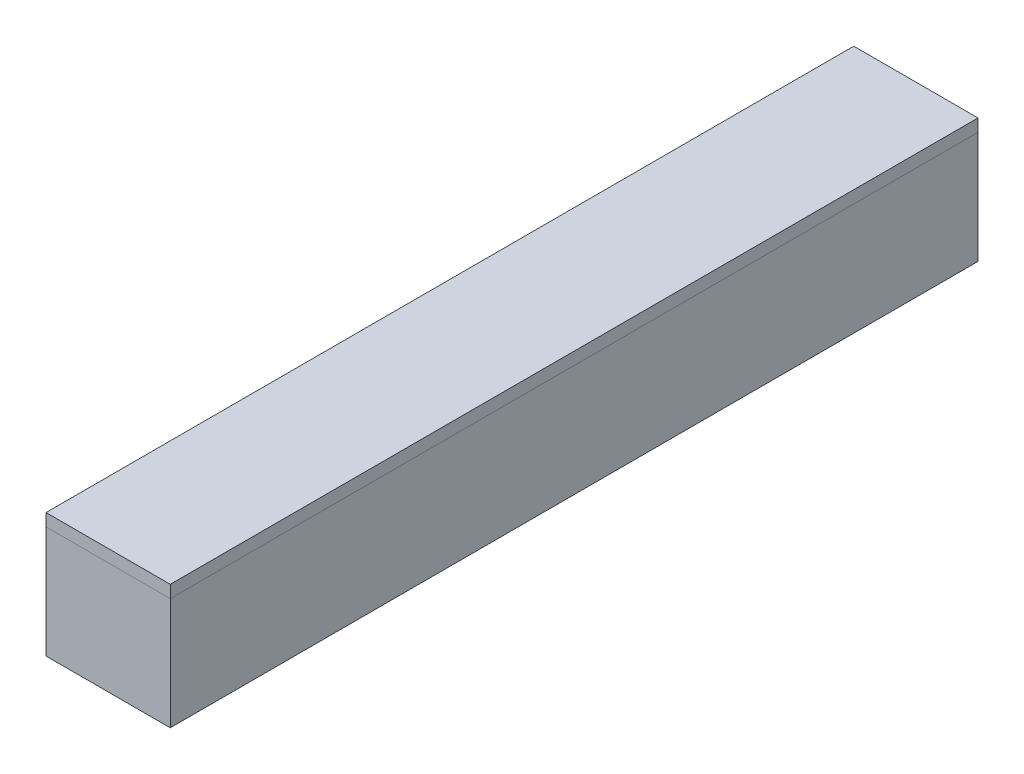
ISO-10303-21;
HEADER;
FILE_DESCRIPTION(('STEP AP214'),'2;1');
FILE_NAME('part.step','',(''),(''),'','','');
FILE_SCHEMA(('AUTOMOTIVE_DESIGN { 1 0 10303 214 1 1 1 1 }'));
ENDSEC;
DATA;
#1=APPLICATION_CONTEXT('core data for automotive mechanical design processes');
#2=APPLICATION_PROTOCOL_DEFINITION('international standard','automotive_design',2000,#1);
#3=PRODUCT_CONTEXT('',#1,'mechanical');
#4=PRODUCT('Part','Part','',(#3));
#5=PRODUCT_RELATED_PRODUCT_CATEGORY('part','',(#4));
#6=PRODUCT_DEFINITION_FORMATION('','',#4);
#7=PRODUCT_DEFINITION_CONTEXT('part definition',#1,'design');
#8=PRODUCT_DEFINITION('design','',#6,#7);
#9=PRODUCT_DEFINITION_SHAPE('','',#8);
#10=(LENGTH_UNIT() NAMED_UNIT(*) SI_UNIT(.MILLI.,.METRE.));
#11=(NAMED_UNIT(*) PLANE_ANGLE_UNIT() SI_UNIT($,.RADIAN.));
#12=(NAMED_UNIT(*) SI_UNIT($,.STERADIAN.) SOLID_ANGLE_UNIT());
#13=UNCERTAINTY_MEASURE_WITH_UNIT(LENGTH_MEASURE(1.E-05),#10,'distance_accuracy_value','');
#14=(GEOMETRIC_REPRESENTATION_CONTEXT(3) GLOBAL_UNCERTAINTY_ASSIGNED_CONTEXT((#13)) GLOBAL_UNIT_ASSIGNED_CONTEXT((#10,
#11,#12)) REPRESENTATION_CONTEXT('',''));
#15=CARTESIAN_POINT('',(0.,0.,0.));
#16=DIRECTION('',(0.,0.,1.));
#17=DIRECTION('',(1.,0.,0.));
#18=AXIS2_PLACEMENT_3D('',#15,#16,#17);
#19=CARTESIAN_POINT('',(0.,-1.,0.));
#20=DIRECTION('',(0.,1.,0.));
#21=DIRECTION('',(0.,0.,1.));
#22=AXIS2_PLACEMENT_3D('',#19,#20,#21);
#23=PLANE('',#22);
#24=DIRECTION('',(-0.0610485395348482,0.,0.998134798421868));
#25=VECTOR('',#24,1.);
#26=CARTESIAN_POINT('',(-1.22436892716817,-0.999999999999999,27.9934717944765));
#27=LINE('',#26,#25);
#28=CARTESIAN_POINT('',(-0.79702915042423,-0.999999999999999,21.0065282055235));
#29=VERTEX_POINT('',#28);
#30=CARTESIAN_POINT('',(-1.22436892716817,-0.999999999999999,27.9934717944765));
#31=VERTEX_POINT('',#30);
#32=EDGE_CURVE('E155',#29,#31,#27,.T.);
#33=ORIENTED_EDGE('',*,*,#32,.T.);
#34=DIRECTION('',(-1.,0.,0.));
#35=VECTOR('',#34,1.);
#36=CARTESIAN_POINT('',(-8.22436892716817,-0.999999999999999,27.9934717944765));
#37=LINE('',#36,#35);
#38=CARTESIAN_POINT('',(-8.22436892716817,-0.999999999999999,27.9934717944765));
#39=VERTEX_POINT('',#38);
#40=EDGE_CURVE('E210',#31,#39,#37,.T.);
#41=ORIENTED_EDGE('',*,*,#40,.T.);
#42=DIRECTION('',(0.0610485395348484,0.,-0.998134798421868));
#43=VECTOR('',#42,1.);
#44=CARTESIAN_POINT('',(-8.22436892716817,-0.999999999999999,27.9934717944765));
#45=LINE('',#44,#43);
#46=CARTESIAN_POINT('',(-7.79702915042423,-0.999999999999999,21.0065282055235));
#47=VERTEX_POINT('',#46);
#48=EDGE_CURVE('E213',#39,#47,#45,.T.);
#49=ORIENTED_EDGE('',*,*,#48,.T.);
#50=DIRECTION('',(1.,0.,0.));
#51=VECTOR('',#50,1.);
#52=CARTESIAN_POINT('',(-7.79702915042423,-0.999999999999999,21.0065282055235));
#53=LINE('',#52,#51);
#54=EDGE_CURVE('E216',#47,#29,#53,.T.);
#55=ORIENTED_EDGE('',*,*,#54,.T.);
#56=EDGE_LOOP('',(#33,#41,#49,#55));
#57=FACE_BOUND('',#56,.T.);
#58=DIRECTION('',(-1.,0.,0.));
#59=VECTOR('',#58,1.);
#60=CARTESIAN_POINT('',(-9.20297084957579,-0.999999999999999,43.9934717944765));
#61=LINE('',#60,#59);
#62=CARTESIAN_POINT('',(-2.20297084957579,-0.999999999999999,43.9934717944765));
#63=VERTEX_POINT('',#62);
#64=CARTESIAN_POINT('',(-9.20297084957579,-0.999999999999999,43.9934717944765));
#65=VERTEX_POINT('',#64);
#66=EDGE_CURVE('E144',#63,#65,#61,.T.);
#67=ORIENTED_EDGE('',*,*,#66,.T.);
#68=DIRECTION('',(0.0610485395348502,0.,-0.998134798421867));
#69=VECTOR('',#68,1.);
#70=CARTESIAN_POINT('',(-8.77563107283184,-0.999999999999999,37.0065282055235));
#71=LINE('',#70,#69);
#72=CARTESIAN_POINT('',(-8.77563107283184,-0.999999999999999,37.0065282055235));
#73=VERTEX_POINT('',#72);
#74=EDGE_CURVE('E149',#65,#73,#71,.T.);
#75=ORIENTED_EDGE('',*,*,#74,.T.);
#76=DIRECTION('',(1.,0.,0.));
#77=VECTOR('',#76,1.);
#78=CARTESIAN_POINT('',(-8.77563107283184,-0.999999999999999,37.0065282055235));
#79=LINE('',#78,#77);
#80=CARTESIAN_POINT('',(-1.77563107283184,-0.999999999999999,37.0065282055235));
#81=VERTEX_POINT('',#80);
#82=EDGE_CURVE('E156',#73,#81,#79,.T.);
#83=ORIENTED_EDGE('',*,*,#82,.T.);
#84=DIRECTION('',(-0.06104853953485,0.,0.998134798421867));
#85=VECTOR('',#84,1.);
#86=CARTESIAN_POINT('',(-1.77563107283184,-0.999999999999999,37.0065282055235));
#87=LINE('',#86,#85);
#88=EDGE_CURVE('E160',#81,#63,#87,.T.);
#89=ORIENTED_EDGE('',*,*,#88,.T.);
#90=EDGE_LOOP('',(#67,#75,#83,#89));
#91=FACE_BOUND('',#90,.T.);
#92=DIRECTION('',(1.,0.,0.));
#93=VECTOR('',#92,1.);
#94=CARTESIAN_POINT('',(0.,-1.,0.));
#95=LINE('',#94,#93);
#96=CARTESIAN_POINT('',(-10.,-1.,0.));
#97=VERTEX_POINT('',#96);
#98=CARTESIAN_POINT('',(0.,-1.,0.));
#99=VERTEX_POINT('',#98);
#100=EDGE_CURVE('E201',#97,#99,#95,.T.);
#101=ORIENTED_EDGE('',*,*,#100,.F.);
#102=DIRECTION('',(0.,0.,-1.));
#103=VECTOR('',#102,1.);
#104=CARTESIAN_POINT('',(-10.,-1.,0.));
#105=LINE('',#104,#103);
#106=CARTESIAN_POINT('',(-10.,-1.,65.));
#107=VERTEX_POINT('',#106);
#108=EDGE_CURVE('E168',#107,#97,#105,.T.);
#109=ORIENTED_EDGE('',*,*,#108,.F.);
#110=DIRECTION('',(1.,0.,0.));
#111=VECTOR('',#110,1.);
#112=CARTESIAN_POINT('',(0.,-1.,65.));
#113=LINE('',#112,#111);
#114=CARTESIAN_POINT('',(0.,-1.,65.));
#115=VERTEX_POINT('',#114);
#116=EDGE_CURVE('E207',#107,#115,#113,.T.);
#117=ORIENTED_EDGE('',*,*,#116,.T.);
#118=DIRECTION('',(0.,0.,-1.));
#119=VECTOR('',#118,1.);
#120=CARTESIAN_POINT('',(0.,-1.,0.));
#121=LINE('',#120,#119);
#122=EDGE_CURVE('E204',#115,#99,#121,.T.);
#123=ORIENTED_EDGE('',*,*,#122,.T.);
#124=EDGE_LOOP('',(#101,#109,#117,#123));
#125=FACE_BOUND('',#124,.T.);
#126=ADVANCED_FACE('F51',(#57,#91,#125),#23,.T.);
#127=CARTESIAN_POINT('',(0.,-0.64,0.));
#128=DIRECTION('',(-1.,0.,0.));
#129=DIRECTION('',(0.,0.,1.));
#130=AXIS2_PLACEMENT_3D('',#127,#128,#129);
#131=PLANE('',#130);
#132=ORIENTED_EDGE('',*,*,#122,.F.);
#133=DIRECTION('',(0.,1.,0.));
#134=VECTOR('',#133,1.);
#135=CARTESIAN_POINT('',(0.,-0.64,65.));
#136=LINE('',#135,#134);
#137=CARTESIAN_POINT('',(0.,-10.,65.));
#138=VERTEX_POINT('',#137);
#139=EDGE_CURVE('E167',#138,#115,#136,.T.);
#140=ORIENTED_EDGE('',*,*,#139,.F.);
#141=DIRECTION('',(0.,0.,-1.));
#142=VECTOR('',#141,1.);
#143=CARTESIAN_POINT('',(0.,-10.,0.));
#144=LINE('',#143,#142);
#145=CARTESIAN_POINT('',(0.,-10.,0.));
#146=VERTEX_POINT('',#145);
#147=EDGE_CURVE('E180',#138,#146,#144,.T.);
#148=ORIENTED_EDGE('',*,*,#147,.T.);
#149=DIRECTION('',(0.,1.,0.));
#150=VECTOR('',#149,1.);
#151=CARTESIAN_POINT('',(0.,-0.64,0.));
#152=LINE('',#151,#150);
#153=EDGE_CURVE('E165',#146,#99,#152,.T.);
#154=ORIENTED_EDGE('',*,*,#153,.T.);
#155=EDGE_LOOP('',(#132,#140,#148,#154));
#156=FACE_BOUND('',#155,.T.);
#157=ADVANCED_FACE('F252',(#156),#131,.F.);
#158=CARTESIAN_POINT('',(-8.22436892716817,-10.,27.9934717944765));
#159=DIRECTION('',(-0.998134798421868,0.,-0.0610485395348484));
#160=DIRECTION('',(-0.0610485395348484,0.,0.998134798421868));
#161=AXIS2_PLACEMENT_3D('',#158,#159,#160);
#162=PLANE('',#161);
#163=ORIENTED_EDGE('',*,*,#48,.F.);
#164=DIRECTION('',(0.,1.,0.));
#165=VECTOR('',#164,1.);
#166=CARTESIAN_POINT('',(-8.22436892716817,-10.,27.9934717944765));
#167=LINE('',#166,#165);
#168=CARTESIAN_POINT('',(-8.22436892716817,-10.,27.9934717944765));
#169=VERTEX_POINT('',#168);
#170=EDGE_CURVE('E177',#169,#39,#167,.T.);
#171=ORIENTED_EDGE('',*,*,#170,.F.);
#172=DIRECTION('',(-0.0610485395348484,0.,0.998134798421868));
#173=VECTOR('',#172,1.);
#174=CARTESIAN_POINT('',(-8.22436892716817,-10.,27.9934717944765));
#175=LINE('',#174,#173);
#176=CARTESIAN_POINT('',(-7.79702915042423,-10.,21.0065282055235));
#177=VERTEX_POINT('',#176);
#178=EDGE_CURVE('E186',#177,#169,#175,.T.);
#179=ORIENTED_EDGE('',*,*,#178,.F.);
#180=DIRECTION('',(0.,1.,0.));
#181=VECTOR('',#180,1.);
#182=CARTESIAN_POINT('',(-7.79702915042423,-10.,21.0065282055235));
#183=LINE('',#182,#181);
#184=EDGE_CURVE('E179',#177,#47,#183,.T.);
#185=ORIENTED_EDGE('',*,*,#184,.T.);
#186=EDGE_LOOP('',(#163,#171,#179,#185));
#187=FACE_BOUND('',#186,.T.);
#188=ADVANCED_FACE('F269',(#187),#162,.F.);
#189=CARTESIAN_POINT('',(-8.22436892716817,-10.,27.9934717944765));
#190=DIRECTION('',(0.,0.,1.));
#191=DIRECTION('',(1.,0.,0.));
#192=AXIS2_PLACEMENT_3D('',#189,#190,#191);
#193=PLANE('',#192);
#194=ORIENTED_EDGE('',*,*,#40,.F.);
#195=DIRECTION('',(0.,1.,0.));
#196=VECTOR('',#195,1.);
#197=CARTESIAN_POINT('',(-1.22436892716817,-10.,27.9934717944765));
#198=LINE('',#197,#196);
#199=CARTESIAN_POINT('',(-1.22436892716817,-10.,27.9934717944765));
#200=VERTEX_POINT('',#199);
#201=EDGE_CURVE('E184',#200,#31,#198,.T.);
#202=ORIENTED_EDGE('',*,*,#201,.F.);
#203=DIRECTION('',(1.,0.,0.));
#204=VECTOR('',#203,1.);
#205=CARTESIAN_POINT('',(-8.22436892716817,-10.,27.9934717944765));
#206=LINE('',#205,#204);
#207=EDGE_CURVE('E188',#169,#200,#206,.T.);
#208=ORIENTED_EDGE('',*,*,#207,.F.);
#209=ORIENTED_EDGE('',*,*,#170,.T.);
#210=EDGE_LOOP('',(#194,#202,#208,#209));
#211=FACE_BOUND('',#210,.T.);
#212=ADVANCED_FACE('F274',(#211),#193,.F.);
#213=CARTESIAN_POINT('',(-8.77563107283184,-10.,37.0065282055235));
#214=DIRECTION('',(0.,0.,-1.));
#215=DIRECTION('',(-1.,0.,0.));
#216=AXIS2_PLACEMENT_3D('',#213,#214,#215);
#217=PLANE('',#216);
#218=ORIENTED_EDGE('',*,*,#82,.F.);
#219=DIRECTION('',(0.,1.,0.));
#220=VECTOR('',#219,1.);
#221=CARTESIAN_POINT('',(-8.77563107283184,-10.,37.0065282055235));
#222=LINE('',#221,#220);
#223=CARTESIAN_POINT('',(-8.77563107283184,-10.,37.0065282055235));
#224=VERTEX_POINT('',#223);
#225=EDGE_CURVE('E151',#224,#73,#222,.T.);
#226=ORIENTED_EDGE('',*,*,#225,.F.);
#227=DIRECTION('',(-1.,0.,0.));
#228=VECTOR('',#227,1.);
#229=CARTESIAN_POINT('',(-8.77563107283184,-10.,37.0065282055235));
#230=LINE('',#229,#228);
#231=CARTESIAN_POINT('',(-1.77563107283184,-10.,37.0065282055235));
#232=VERTEX_POINT('',#231);
#233=EDGE_CURVE('E146',#232,#224,#230,.T.);
#234=ORIENTED_EDGE('',*,*,#233,.F.);
#235=DIRECTION('',(0.,1.,0.));
#236=VECTOR('',#235,1.);
#237=CARTESIAN_POINT('',(-1.77563107283184,-10.,37.0065282055235));
#238=LINE('',#237,#236);
#239=EDGE_CURVE('E75',#232,#81,#238,.T.);
#240=ORIENTED_EDGE('',*,*,#239,.T.);
#241=EDGE_LOOP('',(#218,#226,#234,#240));
#242=FACE_BOUND('',#241,.T.);
#243=ADVANCED_FACE('F221',(#242),#217,.F.);
#244=CARTESIAN_POINT('',(-8.77563107283184,-10.,37.0065282055235));
#245=DIRECTION('',(-0.998134798421867,0.,-0.0610485395348502));
#246=DIRECTION('',(-0.0610485395348502,0.,0.998134798421867));
#247=AXIS2_PLACEMENT_3D('',#244,#245,#246);
#248=PLANE('',#247);
#249=ORIENTED_EDGE('',*,*,#74,.F.);
#250=DIRECTION('',(0.,1.,0.));
#251=VECTOR('',#250,1.);
#252=CARTESIAN_POINT('',(-9.20297084957579,-10.,43.9934717944765));
#253=LINE('',#252,#251);
#254=CARTESIAN_POINT('',(-9.20297084957579,-10.,43.9934717944765));
#255=VERTEX_POINT('',#254);
#256=EDGE_CURVE('E55',#255,#65,#253,.T.);
#257=ORIENTED_EDGE('',*,*,#256,.F.);
#258=DIRECTION('',(-0.0610485395348502,0.,0.998134798421867));
#259=VECTOR('',#258,1.);
#260=CARTESIAN_POINT('',(-8.77563107283184,-10.,37.0065282055235));
#261=LINE('',#260,#259);
#262=EDGE_CURVE('E12',#224,#255,#261,.T.);
#263=ORIENTED_EDGE('',*,*,#262,.F.);
#264=ORIENTED_EDGE('',*,*,#225,.T.);
#265=EDGE_LOOP('',(#249,#257,#263,#264));
#266=FACE_BOUND('',#265,.T.);
#267=ADVANCED_FACE('F150',(#266),#248,.F.);
#268=CARTESIAN_POINT('',(0.,-10.,0.));
#269=DIRECTION('',(0.,-1.,0.));
#270=DIRECTION('',(0.,0.,-1.));
#271=AXIS2_PLACEMENT_3D('',#268,#269,#270);
#272=PLANE('',#271);
#273=ORIENTED_EDGE('',*,*,#262,.T.);
#274=DIRECTION('',(1.,0.,0.));
#275=VECTOR('',#274,1.);
#276=CARTESIAN_POINT('',(-9.20297084957579,-10.,43.9934717944765));
#277=LINE('',#276,#275);
#278=CARTESIAN_POINT('',(-2.20297084957579,-10.,43.9934717944765));
#279=VERTEX_POINT('',#278);
#280=EDGE_CURVE('E60',#255,#279,#277,.T.);
#281=ORIENTED_EDGE('',*,*,#280,.T.);
#282=DIRECTION('',(0.06104853953485,0.,-0.998134798421867));
#283=VECTOR('',#282,1.);
#284=CARTESIAN_POINT('',(-1.77563107283184,-10.,37.0065282055235));
#285=LINE('',#284,#283);
#286=EDGE_CURVE('E191',#279,#232,#285,.T.);
#287=ORIENTED_EDGE('',*,*,#286,.T.);
#288=ORIENTED_EDGE('',*,*,#233,.T.);
#289=EDGE_LOOP('',(#273,#281,#287,#288));
#290=FACE_BOUND('',#289,.T.);
#291=ORIENTED_EDGE('',*,*,#207,.T.);
#292=DIRECTION('',(0.0610485395348482,0.,-0.998134798421868));
#293=VECTOR('',#292,1.);
#294=CARTESIAN_POINT('',(-1.22436892716817,-10.,27.9934717944765));
#295=LINE('',#294,#293);
#296=CARTESIAN_POINT('',(-0.79702915042423,-10.,21.0065282055235));
#297=VERTEX_POINT('',#296);
#298=EDGE_CURVE('E225',#200,#297,#295,.T.);
#299=ORIENTED_EDGE('',*,*,#298,.T.);
#300=DIRECTION('',(-1.,0.,0.));
#301=VECTOR('',#300,1.);
#302=CARTESIAN_POINT('',(-7.79702915042423,-10.,21.0065282055235));
#303=LINE('',#302,#301);
#304=EDGE_CURVE('E228',#297,#177,#303,.T.);
#305=ORIENTED_EDGE('',*,*,#304,.T.);
#306=ORIENTED_EDGE('',*,*,#178,.T.);
#307=EDGE_LOOP('',(#291,#299,#305,#306));
#308=FACE_BOUND('',#307,.T.);
#309=ORIENTED_EDGE('',*,*,#147,.F.);
#310=DIRECTION('',(1.,0.,0.));
#311=VECTOR('',#310,1.);
#312=CARTESIAN_POINT('',(0.,-10.,65.));
#313=LINE('',#312,#311);
#314=CARTESIAN_POINT('',(-10.,-10.,65.));
#315=VERTEX_POINT('',#314);
#316=EDGE_CURVE('E176',#315,#138,#313,.T.);
#317=ORIENTED_EDGE('',*,*,#316,.F.);
#318=DIRECTION('',(0.,0.,1.));
#319=VECTOR('',#318,1.);
#320=CARTESIAN_POINT('',(-10.,-10.,0.));
#321=LINE('',#320,#319);
#322=CARTESIAN_POINT('',(-10.,-10.,0.));
#323=VERTEX_POINT('',#322);
#324=EDGE_CURVE('E238',#323,#315,#321,.T.);
#325=ORIENTED_EDGE('',*,*,#324,.F.);
#326=DIRECTION('',(-1.,0.,0.));
#327=VECTOR('',#326,1.);
#328=CARTESIAN_POINT('',(0.,-10.,0.));
#329=LINE('',#328,#327);
#330=EDGE_CURVE('E235',#146,#323,#329,.T.);
#331=ORIENTED_EDGE('',*,*,#330,.F.);
#332=EDGE_LOOP('',(#309,#317,#325,#331));
#333=FACE_BOUND('',#332,.T.);
#334=ADVANCED_FACE('F193',(#290,#308,#333),#272,.T.);
#335=CARTESIAN_POINT('',(-1.77563107283184,-10.,37.0065282055235));
#336=DIRECTION('',(0.998134798421867,0.,0.06104853953485));
#337=DIRECTION('',(0.06104853953485,0.,-0.998134798421867));
#338=AXIS2_PLACEMENT_3D('',#335,#336,#337);
#339=PLANE('',#338);
#340=ORIENTED_EDGE('',*,*,#88,.F.);
#341=ORIENTED_EDGE('',*,*,#239,.F.);
#342=ORIENTED_EDGE('',*,*,#286,.F.);
#343=DIRECTION('',(0.,1.,0.));
#344=VECTOR('',#343,1.);
#345=CARTESIAN_POINT('',(-2.20297084957579,-10.,43.9934717944765));
#346=LINE('',#345,#344);
#347=EDGE_CURVE('E147',#279,#63,#346,.T.);
#348=ORIENTED_EDGE('',*,*,#347,.T.);
#349=EDGE_LOOP('',(#340,#341,#342,#348));
#350=FACE_BOUND('',#349,.T.);
#351=ADVANCED_FACE('F189',(#350),#339,.F.);
#352=CARTESIAN_POINT('',(-9.20297084957579,-10.,43.9934717944765));
#353=DIRECTION('',(0.,0.,1.));
#354=DIRECTION('',(1.,0.,0.));
#355=AXIS2_PLACEMENT_3D('',#352,#353,#354);
#356=PLANE('',#355);
#357=ORIENTED_EDGE('',*,*,#66,.F.);
#358=ORIENTED_EDGE('',*,*,#347,.F.);
#359=ORIENTED_EDGE('',*,*,#280,.F.);
#360=ORIENTED_EDGE('',*,*,#256,.T.);
#361=EDGE_LOOP('',(#357,#358,#359,#360));
#362=FACE_BOUND('',#361,.T.);
#363=ADVANCED_FACE('F141',(#362),#356,.F.);
#364=CARTESIAN_POINT('',(-7.79702915042423,-10.,21.0065282055235));
#365=DIRECTION('',(0.,0.,-1.));
#366=DIRECTION('',(-1.,0.,0.));
#367=AXIS2_PLACEMENT_3D('',#364,#365,#366);
#368=PLANE('',#367);
#369=ORIENTED_EDGE('',*,*,#54,.F.);
#370=ORIENTED_EDGE('',*,*,#184,.F.);
#371=ORIENTED_EDGE('',*,*,#304,.F.);
#372=DIRECTION('',(0.,1.,0.));
#373=VECTOR('',#372,1.);
#374=CARTESIAN_POINT('',(-0.79702915042423,-10.,21.0065282055235));
#375=LINE('',#374,#373);
#376=EDGE_CURVE('E182',#297,#29,#375,.T.);
#377=ORIENTED_EDGE('',*,*,#376,.T.);
#378=EDGE_LOOP('',(#369,#370,#371,#377));
#379=FACE_BOUND('',#378,.T.);
#380=ADVANCED_FACE('F264',(#379),#368,.F.);
#381=CARTESIAN_POINT('',(-1.22436892716817,-10.,27.9934717944765));
#382=DIRECTION('',(0.998134798421868,0.,0.0610485395348482));
#383=DIRECTION('',(0.0610485395348482,0.,-0.998134798421868));
#384=AXIS2_PLACEMENT_3D('',#381,#382,#383);
#385=PLANE('',#384);
#386=ORIENTED_EDGE('',*,*,#32,.F.);
#387=ORIENTED_EDGE('',*,*,#376,.F.);
#388=ORIENTED_EDGE('',*,*,#298,.F.);
#389=ORIENTED_EDGE('',*,*,#201,.T.);
#390=EDGE_LOOP('',(#386,#387,#388,#389));
#391=FACE_BOUND('',#390,.T.);
#392=ADVANCED_FACE('F258',(#391),#385,.F.);
#393=CARTESIAN_POINT('',(0.,-0.64,0.));
#394=DIRECTION('',(0.,0.,-1.));
#395=DIRECTION('',(-1.,0.,0.));
#396=AXIS2_PLACEMENT_3D('',#393,#394,#395);
#397=PLANE('',#396);
#398=DIRECTION('',(0.,1.,0.));
#399=VECTOR('',#398,1.);
#400=CARTESIAN_POINT('',(-10.,-0.64,0.));
#401=LINE('',#400,#399);
#402=EDGE_CURVE('E173',#323,#97,#401,.T.);
#403=ORIENTED_EDGE('',*,*,#402,.T.);
#404=ORIENTED_EDGE('',*,*,#100,.T.);
#405=ORIENTED_EDGE('',*,*,#153,.F.);
#406=ORIENTED_EDGE('',*,*,#330,.T.);
#407=EDGE_LOOP('',(#403,#404,#405,#406));
#408=FACE_BOUND('',#407,.T.);
#409=ADVANCED_FACE('F256',(#408),#397,.T.);
#410=CARTESIAN_POINT('',(0.,-0.64,65.));
#411=DIRECTION('',(0.,0.,-1.));
#412=DIRECTION('',(-1.,0.,0.));
#413=AXIS2_PLACEMENT_3D('',#410,#411,#412);
#414=PLANE('',#413);
#415=ORIENTED_EDGE('',*,*,#116,.F.);
#416=DIRECTION('',(0.,1.,0.));
#417=VECTOR('',#416,1.);
#418=CARTESIAN_POINT('',(-10.,-0.64,65.));
#419=LINE('',#418,#417);
#420=EDGE_CURVE('E170',#315,#107,#419,.T.);
#421=ORIENTED_EDGE('',*,*,#420,.F.);
#422=ORIENTED_EDGE('',*,*,#316,.T.);
#423=ORIENTED_EDGE('',*,*,#139,.T.);
#424=EDGE_LOOP('',(#415,#421,#422,#423));
#425=FACE_BOUND('',#424,.T.);
#426=ADVANCED_FACE('F245',(#425),#414,.F.);
#427=CARTESIAN_POINT('',(-10.,-0.64,0.));
#428=DIRECTION('',(-1.,0.,0.));
#429=DIRECTION('',(0.,0.,1.));
#430=AXIS2_PLACEMENT_3D('',#427,#428,#429);
#431=PLANE('',#430);
#432=ORIENTED_EDGE('',*,*,#420,.T.);
#433=ORIENTED_EDGE('',*,*,#108,.T.);
#434=ORIENTED_EDGE('',*,*,#402,.F.);
#435=ORIENTED_EDGE('',*,*,#324,.T.);
#436=EDGE_LOOP('',(#432,#433,#434,#435));
#437=FACE_BOUND('',#436,.T.);
#438=ADVANCED_FACE('F53',(#437),#431,.T.);
#439=CLOSED_SHELL('',(#126,#157,#188,#212,#243,#267,#334,#351,#363,#380,#392,#409,#426,#438));
#440=MANIFOLD_SOLID_BREP('B2',#439);
#441=CARTESIAN_POINT('',(0.,-1.,0.));
#442=DIRECTION('',(0.,1.,0.));
#443=DIRECTION('',(0.,0.,1.));
#444=AXIS2_PLACEMENT_3D('',#441,#442,#443);
#445=PLANE('',#444);
#446=DIRECTION('',(1.,0.,0.));
#447=VECTOR('',#446,1.);
#448=CARTESIAN_POINT('',(0.,-1.,0.));
#449=LINE('',#448,#447);
#450=CARTESIAN_POINT('',(-10.,-1.,0.));
#451=VERTEX_POINT('',#450);
#452=CARTESIAN_POINT('',(0.,-1.,0.));
#453=VERTEX_POINT('',#452);
#454=EDGE_CURVE('E400',#451,#453,#449,.T.);
#455=ORIENTED_EDGE('',*,*,#454,.T.);
#456=DIRECTION('',(0.,0.,-1.));
#457=VECTOR('',#456,1.);
#458=CARTESIAN_POINT('',(0.,-1.,0.));
#459=LINE('',#458,#457);
#460=CARTESIAN_POINT('',(0.,-1.,65.));
#461=VERTEX_POINT('',#460);
#462=EDGE_CURVE('E569',#461,#453,#459,.T.);
#463=ORIENTED_EDGE('',*,*,#462,.F.);
#464=DIRECTION('',(1.,0.,0.));
#465=VECTOR('',#464,1.);
#466=CARTESIAN_POINT('',(0.,-1.,65.));
#467=LINE('',#466,#465);
#468=CARTESIAN_POINT('',(-10.,-1.,65.));
#469=VERTEX_POINT('',#468);
#470=EDGE_CURVE('E567',#469,#461,#467,.T.);
#471=ORIENTED_EDGE('',*,*,#470,.F.);
#472=DIRECTION('',(0.,0.,-1.));
#473=VECTOR('',#472,1.);
#474=CARTESIAN_POINT('',(-10.,-1.,0.));
#475=LINE('',#474,#473);
#476=EDGE_CURVE('E49',#469,#451,#475,.T.);
#477=ORIENTED_EDGE('',*,*,#476,.T.);
#478=EDGE_LOOP('',(#455,#463,#471,#477));
#479=FACE_BOUND('',#478,.T.);
#480=DIRECTION('',(-1.,0.,0.));
#481=VECTOR('',#480,1.);
#482=CARTESIAN_POINT('',(-9.20297084957579,-0.999999999999999,43.9934717944765));
#483=LINE('',#482,#481);
#484=CARTESIAN_POINT('',(-2.20297084957579,-0.999999999999999,43.9934717944765));
#485=VERTEX_POINT('',#484);
#486=CARTESIAN_POINT('',(-9.20297084957579,-0.999999999999999,43.9934717944765));
#487=VERTEX_POINT('',#486);
#488=EDGE_CURVE('E547',#485,#487,#483,.T.);
#489=ORIENTED_EDGE('',*,*,#488,.F.);
#490=DIRECTION('',(-0.06104853953485,0.,0.998134798421867));
#491=VECTOR('',#490,1.);
#492=CARTESIAN_POINT('',(-1.77563107283184,-0.999999999999999,37.0065282055235));
#493=LINE('',#492,#491);
#494=CARTESIAN_POINT('',(-1.77563107283184,-0.999999999999999,37.0065282055235));
#495=VERTEX_POINT('',#494);
#496=EDGE_CURVE('E489',#495,#485,#493,.T.);
#497=ORIENTED_EDGE('',*,*,#496,.F.);
#498=DIRECTION('',(1.,0.,0.));
#499=VECTOR('',#498,1.);
#500=CARTESIAN_POINT('',(-8.77563107283184,-0.999999999999999,37.0065282055235));
#501=LINE('',#500,#499);
#502=CARTESIAN_POINT('',(-8.77563107283184,-0.999999999999999,37.0065282055235));
#503=VERTEX_POINT('',#502);
#504=EDGE_CURVE('E555',#503,#495,#501,.T.);
#505=ORIENTED_EDGE('',*,*,#504,.F.);
#506=DIRECTION('',(0.0610485395348502,0.,-0.998134798421867));
#507=VECTOR('',#506,1.);
#508=CARTESIAN_POINT('',(-8.77563107283184,-0.999999999999999,37.0065282055235));
#509=LINE('',#508,#507);
#510=EDGE_CURVE('E557',#487,#503,#509,.T.);
#511=ORIENTED_EDGE('',*,*,#510,.F.);
#512=EDGE_LOOP('',(#489,#497,#505,#511));
#513=FACE_BOUND('',#512,.T.);
#514=DIRECTION('',(-0.0610485395348482,0.,0.998134798421868));
#515=VECTOR('',#514,1.);
#516=CARTESIAN_POINT('',(-1.22436892716817,-0.999999999999999,27.9934717944765));
#517=LINE('',#516,#515);
#518=CARTESIAN_POINT('',(-0.79702915042423,-0.999999999999999,21.0065282055235));
#519=VERTEX_POINT('',#518);
#520=CARTESIAN_POINT('',(-1.22436892716817,-0.999999999999999,27.9934717944765));
#521=VERTEX_POINT('',#520);
#522=EDGE_CURVE('E559',#519,#521,#517,.T.);
#523=ORIENTED_EDGE('',*,*,#522,.F.);
#524=DIRECTION('',(1.,0.,0.));
#525=VECTOR('',#524,1.);
#526=CARTESIAN_POINT('',(-7.79702915042423,-0.999999999999999,21.0065282055235));
#527=LINE('',#526,#525);
#528=CARTESIAN_POINT('',(-7.79702915042423,-0.999999999999999,21.0065282055235));
#529=VERTEX_POINT('',#528);
#530=EDGE_CURVE('E562',#529,#519,#527,.T.);
#531=ORIENTED_EDGE('',*,*,#530,.F.);
#532=DIRECTION('',(0.0610485395348484,0.,-0.998134798421868));
#533=VECTOR('',#532,1.);
#534=CARTESIAN_POINT('',(-8.22436892716817,-0.999999999999999,27.9934717944765));
#535=LINE('',#534,#533);
#536=CARTESIAN_POINT('',(-8.22436892716817,-0.999999999999999,27.9934717944765));
#537=VERTEX_POINT('',#536);
#538=EDGE_CURVE('E564',#537,#529,#535,.T.);
#539=ORIENTED_EDGE('',*,*,#538,.F.);
#540=DIRECTION('',(-1.,0.,0.));
#541=VECTOR('',#540,1.);
#542=CARTESIAN_POINT('',(-8.22436892716817,-0.999999999999999,27.9934717944765));
#543=LINE('',#542,#541);
#544=EDGE_CURVE('E566',#521,#537,#543,.T.);
#545=ORIENTED_EDGE('',*,*,#544,.F.);
#546=EDGE_LOOP('',(#523,#531,#539,#545));
#547=FACE_BOUND('',#546,.T.);
#548=ADVANCED_FACE('F397',(#479,#513,#547),#445,.F.);
#549=CARTESIAN_POINT('',(-8.77563107283184,-10.,37.0065282055235));
#550=DIRECTION('',(0.,0.,-1.));
#551=DIRECTION('',(-1.,0.,0.));
#552=AXIS2_PLACEMENT_3D('',#549,#550,#551);
#553=PLANE('',#552);
#554=DIRECTION('',(0.,1.,0.));
#555=VECTOR('',#554,1.);
#556=CARTESIAN_POINT('',(-8.77563107283184,-10.,37.0065282055235));
#557=LINE('',#556,#555);
#558=CARTESIAN_POINT('',(-8.77563107283184,-0.64,37.0065282055235));
#559=VERTEX_POINT('',#558);
#560=EDGE_CURVE('E752',#503,#559,#557,.T.);
#561=ORIENTED_EDGE('',*,*,#560,.F.);
#562=ORIENTED_EDGE('',*,*,#504,.T.);
#563=DIRECTION('',(0.,1.,0.));
#564=VECTOR('',#563,1.);
#565=CARTESIAN_POINT('',(-1.77563107283184,-10.,37.0065282055235));
#566=LINE('',#565,#564);
#567=CARTESIAN_POINT('',(-1.77563107283184,-0.64,37.0065282055235));
#568=VERTEX_POINT('',#567);
#569=EDGE_CURVE('E494',#495,#568,#566,.T.);
#570=ORIENTED_EDGE('',*,*,#569,.T.);
#571=DIRECTION('',(-1.,0.,0.));
#572=VECTOR('',#571,1.);
#573=CARTESIAN_POINT('',(0.,-0.64,37.0065282055235));
#574=LINE('',#573,#572);
#575=EDGE_CURVE('E505',#568,#559,#574,.T.);
#576=ORIENTED_EDGE('',*,*,#575,.T.);
#577=EDGE_LOOP('',(#561,#562,#570,#576));
#578=FACE_BOUND('',#577,.T.);
#579=ADVANCED_FACE('F597',(#578),#553,.F.);
#580=CARTESIAN_POINT('',(0.,-0.64,0.));
#581=DIRECTION('',(0.,1.,0.));
#582=DIRECTION('',(0.,0.,1.));
#583=AXIS2_PLACEMENT_3D('',#580,#581,#582);
#584=PLANE('',#583);
#585=DIRECTION('',(-0.0610485395348502,0.,0.998134798421867));
#586=VECTOR('',#585,1.);
#587=CARTESIAN_POINT('',(-6.48794431414219,-0.64,-0.396819673643329));
#588=LINE('',#587,#586);
#589=CARTESIAN_POINT('',(-9.20297084957579,-0.64,43.9934717944765));
#590=VERTEX_POINT('',#589);
#591=EDGE_CURVE('E518',#559,#590,#588,.T.);
#592=ORIENTED_EDGE('',*,*,#591,.F.);
#593=ORIENTED_EDGE('',*,*,#575,.F.);
#594=DIRECTION('',(0.06104853953485,0.,-0.998134798421867));
#595=VECTOR('',#594,1.);
#596=CARTESIAN_POINT('',(0.485967216602438,-0.64,0.0297230282746397));
#597=LINE('',#596,#595);
#598=CARTESIAN_POINT('',(-2.20297084957579,-0.64,43.9934717944765));
#599=VERTEX_POINT('',#598);
#600=EDGE_CURVE('E487',#599,#568,#597,.T.);
#601=ORIENTED_EDGE('',*,*,#600,.F.);
#602=DIRECTION('',(1.,0.,0.));
#603=VECTOR('',#602,1.);
#604=CARTESIAN_POINT('',(0.,-0.64,43.9934717944765));
#605=LINE('',#604,#603);
#606=EDGE_CURVE('E502',#590,#599,#605,.T.);
#607=ORIENTED_EDGE('',*,*,#606,.F.);
#608=EDGE_LOOP('',(#592,#593,#601,#607));
#609=FACE_BOUND('',#608,.T.);
#610=ADVANCED_FACE('F501',(#609),#584,.F.);
#611=CARTESIAN_POINT('',(-8.77563107283184,-10.,37.0065282055235));
#612=DIRECTION('',(-0.998134798421867,0.,-0.0610485395348502));
#613=DIRECTION('',(-0.0610485395348502,0.,0.998134798421867));
#614=AXIS2_PLACEMENT_3D('',#611,#612,#613);
#615=PLANE('',#614);
#616=DIRECTION('',(0.,1.,0.));
#617=VECTOR('',#616,1.);
#618=CARTESIAN_POINT('',(-9.20297084957579,-10.,43.9934717944765));
#619=LINE('',#618,#617);
#620=EDGE_CURVE('E495',#487,#590,#619,.T.);
#621=ORIENTED_EDGE('',*,*,#620,.F.);
#622=ORIENTED_EDGE('',*,*,#510,.T.);
#623=ORIENTED_EDGE('',*,*,#560,.T.);
#624=ORIENTED_EDGE('',*,*,#591,.T.);
#625=EDGE_LOOP('',(#621,#622,#623,#624));
#626=FACE_BOUND('',#625,.T.);
#627=ADVANCED_FACE('F608',(#626),#615,.F.);
#628=CARTESIAN_POINT('',(-1.77563107283184,-10.,37.0065282055235));
#629=DIRECTION('',(0.998134798421867,0.,0.06104853953485));
#630=DIRECTION('',(0.06104853953485,0.,-0.998134798421867));
#631=AXIS2_PLACEMENT_3D('',#628,#629,#630);
#632=PLANE('',#631);
#633=ORIENTED_EDGE('',*,*,#569,.F.);
#634=ORIENTED_EDGE('',*,*,#496,.T.);
#635=DIRECTION('',(0.,1.,0.));
#636=VECTOR('',#635,1.);
#637=CARTESIAN_POINT('',(-2.20297084957579,-10.,43.9934717944765));
#638=LINE('',#637,#636);
#639=EDGE_CURVE('E483',#485,#599,#638,.T.);
#640=ORIENTED_EDGE('',*,*,#639,.T.);
#641=ORIENTED_EDGE('',*,*,#600,.T.);
#642=EDGE_LOOP('',(#633,#634,#640,#641));
#643=FACE_BOUND('',#642,.T.);
#644=ADVANCED_FACE('F486',(#643),#632,.F.);
#645=CARTESIAN_POINT('',(-9.20297084957579,-10.,43.9934717944765));
#646=DIRECTION('',(0.,0.,1.));
#647=DIRECTION('',(1.,0.,0.));
#648=AXIS2_PLACEMENT_3D('',#645,#646,#647);
#649=PLANE('',#648);
#650=ORIENTED_EDGE('',*,*,#639,.F.);
#651=ORIENTED_EDGE('',*,*,#488,.T.);
#652=ORIENTED_EDGE('',*,*,#620,.T.);
#653=ORIENTED_EDGE('',*,*,#606,.T.);
#654=EDGE_LOOP('',(#650,#651,#652,#653));
#655=FACE_BOUND('',#654,.T.);
#656=ADVANCED_FACE('F507',(#655),#649,.F.);
#657=CARTESIAN_POINT('',(-8.22436892716817,-10.,27.9934717944765));
#658=DIRECTION('',(-0.998134798421868,0.,-0.0610485395348484));
#659=DIRECTION('',(-0.0610485395348484,0.,0.998134798421868));
#660=AXIS2_PLACEMENT_3D('',#657,#658,#659);
#661=PLANE('',#660);
#662=DIRECTION('',(0.,1.,0.));
#663=VECTOR('',#662,1.);
#664=CARTESIAN_POINT('',(-8.22436892716817,-10.,27.9934717944765));
#665=LINE('',#664,#663);
#666=CARTESIAN_POINT('',(-8.22436892716817,-0.64,27.9934717944765));
#667=VERTEX_POINT('',#666);
#668=EDGE_CURVE('E509',#537,#667,#665,.T.);
#669=ORIENTED_EDGE('',*,*,#668,.F.);
#670=ORIENTED_EDGE('',*,*,#538,.T.);
#671=DIRECTION('',(0.,1.,0.));
#672=VECTOR('',#671,1.);
#673=CARTESIAN_POINT('',(-7.79702915042423,-10.,21.0065282055235));
#674=LINE('',#673,#672);
#675=CARTESIAN_POINT('',(-7.79702915042423,-0.64,21.0065282055235));
#676=VERTEX_POINT('',#675);
#677=EDGE_CURVE('E511',#529,#676,#674,.T.);
#678=ORIENTED_EDGE('',*,*,#677,.T.);
#679=DIRECTION('',(-0.0610485395348484,0.,0.998134798421868));
#680=VECTOR('',#679,1.);
#681=CARTESIAN_POINT('',(-6.48794431414226,-0.64,-0.396819673643322));
#682=LINE('',#681,#680);
#683=EDGE_CURVE('E526',#676,#667,#682,.T.);
#684=ORIENTED_EDGE('',*,*,#683,.T.);
#685=EDGE_LOOP('',(#669,#670,#678,#684));
#686=FACE_BOUND('',#685,.T.);
#687=ADVANCED_FACE('F617',(#686),#661,.F.);
#688=DIRECTION('',(1.,0.,0.));
#689=VECTOR('',#688,1.);
#690=CARTESIAN_POINT('',(0.,-0.64,27.9934717944765));
#691=LINE('',#690,#689);
#692=CARTESIAN_POINT('',(-1.22436892716817,-0.64,27.9934717944765));
#693=VERTEX_POINT('',#692);
#694=EDGE_CURVE('E529',#667,#693,#691,.T.);
#695=ORIENTED_EDGE('',*,*,#694,.F.);
#696=ORIENTED_EDGE('',*,*,#683,.F.);
#697=DIRECTION('',(-1.,0.,0.));
#698=VECTOR('',#697,1.);
#699=CARTESIAN_POINT('',(0.,-0.64,21.0065282055235));
#700=LINE('',#699,#698);
#701=CARTESIAN_POINT('',(-0.79702915042423,-0.64,21.0065282055235));
#702=VERTEX_POINT('',#701);
#703=EDGE_CURVE('E523',#702,#676,#700,.T.);
#704=ORIENTED_EDGE('',*,*,#703,.F.);
#705=DIRECTION('',(0.0610485395348482,0.,-0.998134798421868));
#706=VECTOR('',#705,1.);
#707=CARTESIAN_POINT('',(0.485967216602369,-0.64,0.0297230282746346));
#708=LINE('',#707,#706);
#709=EDGE_CURVE('E520',#693,#702,#708,.T.);
#710=ORIENTED_EDGE('',*,*,#709,.F.);
#711=EDGE_LOOP('',(#695,#696,#704,#710));
#712=FACE_BOUND('',#711,.T.);
#713=ADVANCED_FACE('F610',(#712),#584,.F.);
#714=CARTESIAN_POINT('',(-8.22436892716817,-10.,27.9934717944765));
#715=DIRECTION('',(0.,0.,1.));
#716=DIRECTION('',(1.,0.,0.));
#717=AXIS2_PLACEMENT_3D('',#714,#715,#716);
#718=PLANE('',#717);
#719=DIRECTION('',(0.,1.,0.));
#720=VECTOR('',#719,1.);
#721=CARTESIAN_POINT('',(-1.22436892716817,-10.,27.9934717944765));
#722=LINE('',#721,#720);
#723=EDGE_CURVE('E514',#521,#693,#722,.T.);
#724=ORIENTED_EDGE('',*,*,#723,.F.);
#725=ORIENTED_EDGE('',*,*,#544,.T.);
#726=ORIENTED_EDGE('',*,*,#668,.T.);
#727=ORIENTED_EDGE('',*,*,#694,.T.);
#728=EDGE_LOOP('',(#724,#725,#726,#727));
#729=FACE_BOUND('',#728,.T.);
#730=ADVANCED_FACE('F627',(#729),#718,.F.);
#731=CARTESIAN_POINT('',(-7.79702915042423,-10.,21.0065282055235));
#732=DIRECTION('',(0.,0.,-1.));
#733=DIRECTION('',(-1.,0.,0.));
#734=AXIS2_PLACEMENT_3D('',#731,#732,#733);
#735=PLANE('',#734);
#736=ORIENTED_EDGE('',*,*,#677,.F.);
#737=ORIENTED_EDGE('',*,*,#530,.T.);
#738=DIRECTION('',(0.,1.,0.));
#739=VECTOR('',#738,1.);
#740=CARTESIAN_POINT('',(-0.79702915042423,-10.,21.0065282055235));
#741=LINE('',#740,#739);
#742=EDGE_CURVE('E747',#519,#702,#741,.T.);
#743=ORIENTED_EDGE('',*,*,#742,.T.);
#744=ORIENTED_EDGE('',*,*,#703,.T.);
#745=EDGE_LOOP('',(#736,#737,#743,#744));
#746=FACE_BOUND('',#745,.T.);
#747=ADVANCED_FACE('F623',(#746),#735,.F.);
#748=CARTESIAN_POINT('',(-1.22436892716817,-10.,27.9934717944765));
#749=DIRECTION('',(0.998134798421868,0.,0.0610485395348482));
#750=DIRECTION('',(0.0610485395348482,0.,-0.998134798421868));
#751=AXIS2_PLACEMENT_3D('',#748,#749,#750);
#752=PLANE('',#751);
#753=ORIENTED_EDGE('',*,*,#742,.F.);
#754=ORIENTED_EDGE('',*,*,#522,.T.);
#755=ORIENTED_EDGE('',*,*,#723,.T.);
#756=ORIENTED_EDGE('',*,*,#709,.T.);
#757=EDGE_LOOP('',(#753,#754,#755,#756));
#758=FACE_BOUND('',#757,.T.);
#759=ADVANCED_FACE('F626',(#758),#752,.F.);
#760=CARTESIAN_POINT('',(0.,-0.64,0.));
#761=DIRECTION('',(0.,0.,-1.));
#762=DIRECTION('',(-1.,0.,0.));
#763=AXIS2_PLACEMENT_3D('',#760,#761,#762);
#764=PLANE('',#763);
#765=ORIENTED_EDGE('',*,*,#454,.F.);
#766=DIRECTION('',(0.,1.,0.));
#767=VECTOR('',#766,1.);
#768=CARTESIAN_POINT('',(-10.,-0.64,0.));
#769=LINE('',#768,#767);
#770=CARTESIAN_POINT('',(-10.,0.,0.));
#771=VERTEX_POINT('',#770);
#772=EDGE_CURVE('E544',#451,#771,#769,.T.);
#773=ORIENTED_EDGE('',*,*,#772,.T.);
#774=DIRECTION('',(-1.,0.,0.));
#775=VECTOR('',#774,1.);
#776=CARTESIAN_POINT('',(0.,0.,0.));
#777=LINE('',#776,#775);
#778=CARTESIAN_POINT('',(0.,0.,0.));
#779=VERTEX_POINT('',#778);
#780=EDGE_CURVE('E532',#779,#771,#777,.T.);
#781=ORIENTED_EDGE('',*,*,#780,.F.);
#782=DIRECTION('',(0.,1.,0.));
#783=VECTOR('',#782,1.);
#784=CARTESIAN_POINT('',(0.,-0.64,0.));
#785=LINE('',#784,#783);
#786=EDGE_CURVE('E545',#453,#779,#785,.T.);
#787=ORIENTED_EDGE('',*,*,#786,.F.);
#788=EDGE_LOOP('',(#765,#773,#781,#787));
#789=FACE_BOUND('',#788,.T.);
#790=ADVANCED_FACE('F577',(#789),#764,.T.);
#791=CARTESIAN_POINT('',(0.,-0.64,0.));
#792=DIRECTION('',(-1.,0.,0.));
#793=DIRECTION('',(0.,0.,1.));
#794=AXIS2_PLACEMENT_3D('',#791,#792,#793);
#795=PLANE('',#794);
#796=DIRECTION('',(0.,1.,0.));
#797=VECTOR('',#796,1.);
#798=CARTESIAN_POINT('',(0.,-0.64,65.));
#799=LINE('',#798,#797);
#800=CARTESIAN_POINT('',(0.,0.,65.));
#801=VERTEX_POINT('',#800);
#802=EDGE_CURVE('E548',#461,#801,#799,.T.);
#803=ORIENTED_EDGE('',*,*,#802,.F.);
#804=ORIENTED_EDGE('',*,*,#462,.T.);
#805=ORIENTED_EDGE('',*,*,#786,.T.);
#806=DIRECTION('',(0.,0.,1.));
#807=VECTOR('',#806,1.);
#808=CARTESIAN_POINT('',(0.,0.,0.));
#809=LINE('',#808,#807);
#810=EDGE_CURVE('E541',#779,#801,#809,.T.);
#811=ORIENTED_EDGE('',*,*,#810,.T.);
#812=EDGE_LOOP('',(#803,#804,#805,#811));
#813=FACE_BOUND('',#812,.T.);
#814=ADVANCED_FACE('F579',(#813),#795,.F.);
#815=CARTESIAN_POINT('',(0.,-0.64,65.));
#816=DIRECTION('',(0.,0.,-1.));
#817=DIRECTION('',(-1.,0.,0.));
#818=AXIS2_PLACEMENT_3D('',#815,#816,#817);
#819=PLANE('',#818);
#820=DIRECTION('',(0.,1.,0.));
#821=VECTOR('',#820,1.);
#822=CARTESIAN_POINT('',(-10.,-0.64,65.));
#823=LINE('',#822,#821);
#824=CARTESIAN_POINT('',(-10.,0.,65.));
#825=VERTEX_POINT('',#824);
#826=EDGE_CURVE('E550',#469,#825,#823,.T.);
#827=ORIENTED_EDGE('',*,*,#826,.F.);
#828=ORIENTED_EDGE('',*,*,#470,.T.);
#829=ORIENTED_EDGE('',*,*,#802,.T.);
#830=DIRECTION('',(-1.,0.,0.));
#831=VECTOR('',#830,1.);
#832=CARTESIAN_POINT('',(0.,0.,65.));
#833=LINE('',#832,#831);
#834=EDGE_CURVE('E538',#801,#825,#833,.T.);
#835=ORIENTED_EDGE('',*,*,#834,.T.);
#836=EDGE_LOOP('',(#827,#828,#829,#835));
#837=FACE_BOUND('',#836,.T.);
#838=ADVANCED_FACE('F586',(#837),#819,.F.);
#839=CARTESIAN_POINT('',(-10.,-0.64,0.));
#840=DIRECTION('',(-1.,0.,0.));
#841=DIRECTION('',(0.,0.,1.));
#842=AXIS2_PLACEMENT_3D('',#839,#840,#841);
#843=PLANE('',#842);
#844=ORIENTED_EDGE('',*,*,#476,.F.);
#845=ORIENTED_EDGE('',*,*,#826,.T.);
#846=DIRECTION('',(0.,0.,1.));
#847=VECTOR('',#846,1.);
#848=CARTESIAN_POINT('',(-10.,0.,0.));
#849=LINE('',#848,#847);
#850=EDGE_CURVE('E535',#771,#825,#849,.T.);
#851=ORIENTED_EDGE('',*,*,#850,.F.);
#852=ORIENTED_EDGE('',*,*,#772,.F.);
#853=EDGE_LOOP('',(#844,#845,#851,#852));
#854=FACE_BOUND('',#853,.T.);
#855=ADVANCED_FACE('F587',(#854),#843,.T.);
#856=CARTESIAN_POINT('',(0.,0.,0.));
#857=DIRECTION('',(0.,1.,0.));
#858=DIRECTION('',(0.,0.,1.));
#859=AXIS2_PLACEMENT_3D('',#856,#857,#858);
#860=PLANE('',#859);
#861=ORIENTED_EDGE('',*,*,#780,.T.);
#862=ORIENTED_EDGE('',*,*,#850,.T.);
#863=ORIENTED_EDGE('',*,*,#834,.F.);
#864=ORIENTED_EDGE('',*,*,#810,.F.);
#865=EDGE_LOOP('',(#861,#862,#863,#864));
#866=FACE_BOUND('',#865,.T.);
#867=ADVANCED_FACE('F582',(#866),#860,.T.);
#868=CLOSED_SHELL('',(#548,#579,#610,#627,#644,#656,#687,#713,#730,#747,#759,#790,#814,#838,
#855,#867));
#869=MANIFOLD_SOLID_BREP('B6',#868);
#870=ADVANCED_BREP_SHAPE_REPRESENTATION('',(#18,#440,#869),#14);
#871=SHAPE_DEFINITION_REPRESENTATION(#9,#870);
ENDSEC;
END-ISO-10303-21;
